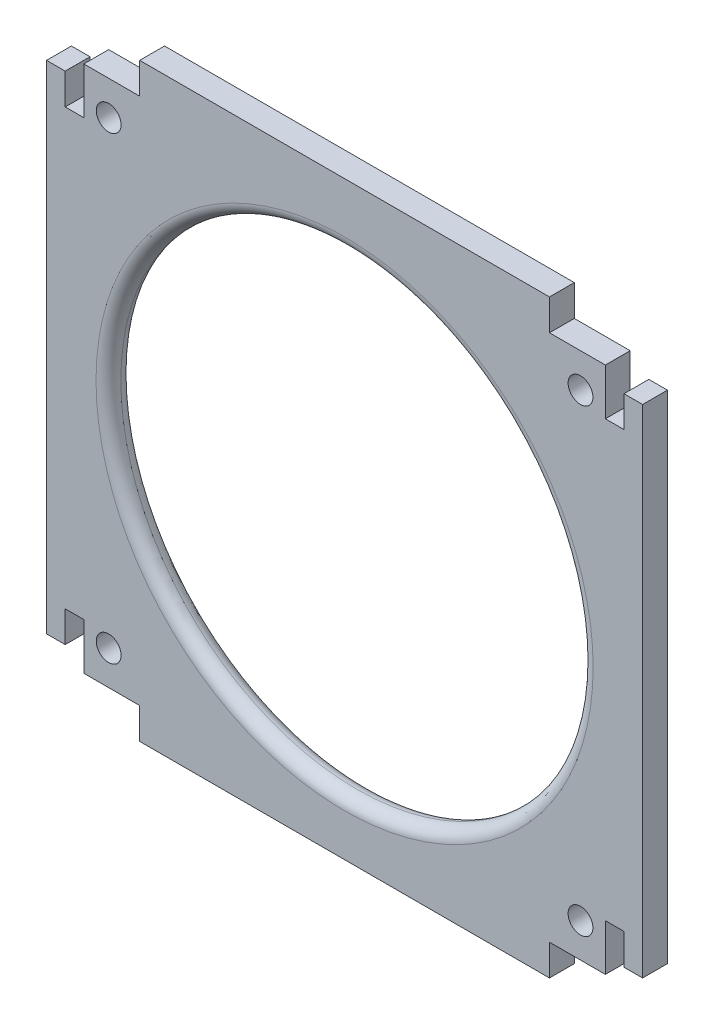
ISO-10303-21;
HEADER;
FILE_DESCRIPTION(('STEP AP214'),'2;1');
FILE_NAME('part.step','',(''),(''),'','','');
FILE_SCHEMA(('AUTOMOTIVE_DESIGN { 1 0 10303 214 1 1 1 1 }'));
ENDSEC;
DATA;
#1=APPLICATION_CONTEXT('core data for automotive mechanical design processes');
#2=APPLICATION_PROTOCOL_DEFINITION('international standard','automotive_design',2000,#1);
#3=PRODUCT_CONTEXT('',#1,'mechanical');
#4=PRODUCT('Part','Part','',(#3));
#5=PRODUCT_RELATED_PRODUCT_CATEGORY('part','',(#4));
#6=PRODUCT_DEFINITION_FORMATION('','',#4);
#7=PRODUCT_DEFINITION_CONTEXT('part definition',#1,'design');
#8=PRODUCT_DEFINITION('design','',#6,#7);
#9=PRODUCT_DEFINITION_SHAPE('','',#8);
#10=(LENGTH_UNIT() NAMED_UNIT(*) SI_UNIT(.MILLI.,.METRE.));
#11=(NAMED_UNIT(*) PLANE_ANGLE_UNIT() SI_UNIT($,.RADIAN.));
#12=(NAMED_UNIT(*) SI_UNIT($,.STERADIAN.) SOLID_ANGLE_UNIT());
#13=UNCERTAINTY_MEASURE_WITH_UNIT(LENGTH_MEASURE(1.E-05),#10,'distance_accuracy_value','');
#14=(GEOMETRIC_REPRESENTATION_CONTEXT(3) GLOBAL_UNCERTAINTY_ASSIGNED_CONTEXT((#13)) GLOBAL_UNIT_ASSIGNED_CONTEXT((#10,
#11,#12)) REPRESENTATION_CONTEXT('',''));
#15=CARTESIAN_POINT('',(0.,0.,0.));
#16=DIRECTION('',(0.,0.,1.));
#17=DIRECTION('',(1.,0.,0.));
#18=AXIS2_PLACEMENT_3D('',#15,#16,#17);
#19=CARTESIAN_POINT('',(0.,0.,4.));
#20=DIRECTION('',(0.,0.,1.));
#21=DIRECTION('',(1.,0.,0.));
#22=AXIS2_PLACEMENT_3D('',#19,#20,#21);
#23=PLANE('',#22);
#24=CARTESIAN_POINT('',(41.9999982969372,-43.1556316148785,4.));
#25=DIRECTION('',(0.,0.,1.));
#26=DIRECTION('',(1.,0.,0.));
#27=AXIS2_PLACEMENT_3D('',#24,#25,#26);
#28=CIRCLE('',#27,40.0334627101331);
#29=CARTESIAN_POINT('',(82.0334610070704,-43.1556316148785,4.));
#30=VERTEX_POINT('',#29);
#31=EDGE_CURVE('E51',#30,#30,#28,.F.);
#32=ORIENTED_EDGE('',*,*,#31,.T.);
#33=EDGE_LOOP('',(#32));
#34=FACE_BOUND('',#33,.T.);
#35=CARTESIAN_POINT('',(79.9999999999949,-79.4999734638956,4.));
#36=DIRECTION('',(0.,0.,1.));
#37=DIRECTION('',(1.,0.,0.));
#38=AXIS2_PLACEMENT_3D('',#35,#36,#37);
#39=CIRCLE('',#38,2.00000000000027);
#40=CARTESIAN_POINT('',(81.9999999999951,-79.4999734638956,4.));
#41=VERTEX_POINT('',#40);
#42=EDGE_CURVE('E411',#41,#41,#39,.T.);
#43=ORIENTED_EDGE('',*,*,#42,.F.);
#44=EDGE_LOOP('',(#43));
#45=FACE_BOUND('',#44,.T.);
#46=CARTESIAN_POINT('',(80.0000433082106,-5.49994542415699,4.));
#47=DIRECTION('',(0.,0.,1.));
#48=DIRECTION('',(1.,0.,0.));
#49=AXIS2_PLACEMENT_3D('',#46,#47,#48);
#50=CIRCLE('',#49,1.99999999999982);
#51=CARTESIAN_POINT('',(82.0000433082105,-5.49994542415699,4.));
#52=VERTEX_POINT('',#51);
#53=EDGE_CURVE('E417',#52,#52,#50,.T.);
#54=ORIENTED_EDGE('',*,*,#53,.F.);
#55=EDGE_LOOP('',(#54));
#56=FACE_BOUND('',#55,.T.);
#57=DIRECTION('',(0.,-1.,0.));
#58=VECTOR('',#57,1.);
#59=CARTESIAN_POINT('',(0.,0.,4.));
#60=LINE('',#59,#58);
#61=CARTESIAN_POINT('',(0.,0.,4.));
#62=VERTEX_POINT('',#61);
#63=CARTESIAN_POINT('',(-2.15973072759112E-13,-7.5,4.));
#64=VERTEX_POINT('',#63);
#65=EDGE_CURVE('E315',#62,#64,#60,.T.);
#66=ORIENTED_EDGE('',*,*,#65,.T.);
#67=DIRECTION('',(-1.,0.,0.));
#68=VECTOR('',#67,1.);
#69=CARTESIAN_POINT('',(-3.00000000000022,-7.5,4.));
#70=LINE('',#69,#68);
#71=CARTESIAN_POINT('',(-3.00000000000022,-7.5,4.));
#72=VERTEX_POINT('',#71);
#73=EDGE_CURVE('E163',#64,#72,#70,.T.);
#74=ORIENTED_EDGE('',*,*,#73,.T.);
#75=DIRECTION('',(0.,1.,0.));
#76=VECTOR('',#75,1.);
#77=CARTESIAN_POINT('',(-3.00000000000022,-2.5,4.));
#78=LINE('',#77,#76);
#79=CARTESIAN_POINT('',(-3.00000000000022,-2.5,4.));
#80=VERTEX_POINT('',#79);
#81=EDGE_CURVE('E429',#72,#80,#78,.T.);
#82=ORIENTED_EDGE('',*,*,#81,.T.);
#83=DIRECTION('',(-1.,0.,0.));
#84=VECTOR('',#83,1.);
#85=CARTESIAN_POINT('',(-3.00000000000022,-2.5,4.));
#86=LINE('',#85,#84);
#87=CARTESIAN_POINT('',(-6.00000000000022,-2.5,4.));
#88=VERTEX_POINT('',#87);
#89=EDGE_CURVE('E431',#80,#88,#86,.T.);
#90=ORIENTED_EDGE('',*,*,#89,.T.);
#91=DIRECTION('',(0.,-1.,0.));
#92=VECTOR('',#91,1.);
#93=CARTESIAN_POINT('',(-6.00000000000022,-2.5,4.));
#94=LINE('',#93,#92);
#95=CARTESIAN_POINT('',(-6.00000000000025,-82.4999999999997,4.));
#96=VERTEX_POINT('',#95);
#97=EDGE_CURVE('E433',#88,#96,#94,.T.);
#98=ORIENTED_EDGE('',*,*,#97,.T.);
#99=DIRECTION('',(1.,0.,0.));
#100=VECTOR('',#99,1.);
#101=CARTESIAN_POINT('',(-6.00000000000025,-82.4999999999997,4.));
#102=LINE('',#101,#100);
#103=CARTESIAN_POINT('',(-3.00000000000024,-82.4999999999997,4.));
#104=VERTEX_POINT('',#103);
#105=EDGE_CURVE('E435',#96,#104,#102,.T.);
#106=ORIENTED_EDGE('',*,*,#105,.T.);
#107=DIRECTION('',(0.,1.,0.));
#108=VECTOR('',#107,1.);
#109=CARTESIAN_POINT('',(-3.00000000000024,-82.4999999999997,4.));
#110=LINE('',#109,#108);
#111=CARTESIAN_POINT('',(-3.00000000000024,-77.4999999999997,4.));
#112=VERTEX_POINT('',#111);
#113=EDGE_CURVE('E437',#104,#112,#110,.T.);
#114=ORIENTED_EDGE('',*,*,#113,.T.);
#115=DIRECTION('',(1.,0.,0.));
#116=VECTOR('',#115,1.);
#117=CARTESIAN_POINT('',(-3.00000000000024,-77.4999999999997,4.));
#118=LINE('',#117,#116);
#119=CARTESIAN_POINT('',(-2.35922392732846E-13,-77.4999999999997,4.));
#120=VERTEX_POINT('',#119);
#121=EDGE_CURVE('E439',#112,#120,#118,.T.);
#122=ORIENTED_EDGE('',*,*,#121,.T.);
#123=DIRECTION('',(0.,-1.,0.));
#124=VECTOR('',#123,1.);
#125=CARTESIAN_POINT('',(-2.35922392732846E-13,-77.4999999999997,4.));
#126=LINE('',#125,#124);
#127=CARTESIAN_POINT('',(0.,-85.0000000000003,4.));
#128=VERTEX_POINT('',#127);
#129=EDGE_CURVE('E441',#120,#128,#126,.T.);
#130=ORIENTED_EDGE('',*,*,#129,.T.);
#131=DIRECTION('',(1.,0.,0.));
#132=VECTOR('',#131,1.);
#133=CARTESIAN_POINT('',(0.,-85.0000000000003,4.));
#134=LINE('',#133,#132);
#135=CARTESIAN_POINT('',(8.99999999999997,-85.0000000000003,4.));
#136=VERTEX_POINT('',#135);
#137=EDGE_CURVE('E443',#128,#136,#134,.T.);
#138=ORIENTED_EDGE('',*,*,#137,.T.);
#139=DIRECTION('',(0.,-1.,0.));
#140=VECTOR('',#139,1.);
#141=CARTESIAN_POINT('',(8.99999999999997,-85.0000000000003,4.));
#142=LINE('',#141,#140);
#143=CARTESIAN_POINT('',(8.99999999999997,-90.0000000000002,4.));
#144=VERTEX_POINT('',#143);
#145=EDGE_CURVE('E445',#136,#144,#142,.T.);
#146=ORIENTED_EDGE('',*,*,#145,.T.);
#147=DIRECTION('',(0.999999999999999,-3.79117202715661E-08,0.));
#148=VECTOR('',#147,1.);
#149=CARTESIAN_POINT('',(8.99999999999997,-90.0000000000002,4.));
#150=LINE('',#149,#148);
#151=CARTESIAN_POINT('',(74.9999930419732,-90.0000025021734,4.));
#152=VERTEX_POINT('',#151);
#153=EDGE_CURVE('E447',#144,#152,#150,.T.);
#154=ORIENTED_EDGE('',*,*,#153,.T.);
#155=DIRECTION('',(7.58234419695496E-08,0.999999999999997,0.));
#156=VECTOR('',#155,1.);
#157=CARTESIAN_POINT('',(74.9999930419732,-90.0000025021734,4.));
#158=LINE('',#157,#156);
#159=CARTESIAN_POINT('',(74.9999934210904,-85.0000025021736,4.));
#160=VERTEX_POINT('',#159);
#161=EDGE_CURVE('E449',#152,#160,#158,.T.);
#162=ORIENTED_EDGE('',*,*,#161,.T.);
#163=DIRECTION('',(1.,0.,0.));
#164=VECTOR('',#163,1.);
#165=CARTESIAN_POINT('',(74.9999934210904,-85.0000025021736,4.));
#166=LINE('',#165,#164);
#167=CARTESIAN_POINT('',(84.,-85.0000025021736,4.));
#168=VERTEX_POINT('',#167);
#169=EDGE_CURVE('E451',#160,#168,#166,.T.);
#170=ORIENTED_EDGE('',*,*,#169,.T.);
#171=DIRECTION('',(0.,1.,0.));
#172=VECTOR('',#171,1.);
#173=CARTESIAN_POINT('',(84.,-85.0000025021736,4.));
#174=LINE('',#173,#172);
#175=CARTESIAN_POINT('',(83.9999999999997,-77.4999999999997,4.));
#176=VERTEX_POINT('',#175);
#177=EDGE_CURVE('E453',#168,#176,#174,.T.);
#178=ORIENTED_EDGE('',*,*,#177,.T.);
#179=DIRECTION('',(1.,0.,0.));
#180=VECTOR('',#179,1.);
#181=CARTESIAN_POINT('',(83.9999999999997,-77.4999999999997,4.));
#182=LINE('',#181,#180);
#183=CARTESIAN_POINT('',(86.9999999999997,-77.4999999999997,4.));
#184=VERTEX_POINT('',#183);
#185=EDGE_CURVE('E455',#176,#184,#182,.T.);
#186=ORIENTED_EDGE('',*,*,#185,.T.);
#187=DIRECTION('',(0.,-1.,0.));
#188=VECTOR('',#187,1.);
#189=CARTESIAN_POINT('',(86.9999999999997,-77.4999999999997,4.));
#190=LINE('',#189,#188);
#191=CARTESIAN_POINT('',(86.9999999999997,-82.4999999999997,4.));
#192=VERTEX_POINT('',#191);
#193=EDGE_CURVE('E457',#184,#192,#190,.T.);
#194=ORIENTED_EDGE('',*,*,#193,.T.);
#195=DIRECTION('',(1.,0.,0.));
#196=VECTOR('',#195,1.);
#197=CARTESIAN_POINT('',(89.9999999999997,-82.4999999999997,4.));
#198=LINE('',#197,#196);
#199=CARTESIAN_POINT('',(89.9999999999997,-82.4999999999997,4.));
#200=VERTEX_POINT('',#199);
#201=EDGE_CURVE('E459',#192,#200,#198,.T.);
#202=ORIENTED_EDGE('',*,*,#201,.T.);
#203=DIRECTION('',(0.,1.,0.));
#204=VECTOR('',#203,1.);
#205=CARTESIAN_POINT('',(89.9999999999998,-2.50000000000001,4.));
#206=LINE('',#205,#204);
#207=CARTESIAN_POINT('',(89.9999999999998,-2.50000000000001,4.));
#208=VERTEX_POINT('',#207);
#209=EDGE_CURVE('E461',#200,#208,#206,.T.);
#210=ORIENTED_EDGE('',*,*,#209,.T.);
#211=DIRECTION('',(-1.,0.,0.));
#212=VECTOR('',#211,1.);
#213=CARTESIAN_POINT('',(86.9999999999998,-2.50000000000001,4.));
#214=LINE('',#213,#212);
#215=CARTESIAN_POINT('',(86.9999999999998,-2.50000000000001,4.));
#216=VERTEX_POINT('',#215);
#217=EDGE_CURVE('E463',#208,#216,#214,.T.);
#218=ORIENTED_EDGE('',*,*,#217,.T.);
#219=DIRECTION('',(0.,-1.,0.));
#220=VECTOR('',#219,1.);
#221=CARTESIAN_POINT('',(86.9999999999998,-7.50000000000001,4.));
#222=LINE('',#221,#220);
#223=CARTESIAN_POINT('',(86.9999999999998,-7.50000000000001,4.));
#224=VERTEX_POINT('',#223);
#225=EDGE_CURVE('E465',#216,#224,#222,.T.);
#226=ORIENTED_EDGE('',*,*,#225,.T.);
#227=DIRECTION('',(-1.,0.,0.));
#228=VECTOR('',#227,1.);
#229=CARTESIAN_POINT('',(83.9999999999998,-7.50000000000001,4.));
#230=LINE('',#229,#228);
#231=CARTESIAN_POINT('',(83.9999999999998,-7.50000000000001,4.));
#232=VERTEX_POINT('',#231);
#233=EDGE_CURVE('E467',#224,#232,#230,.T.);
#234=ORIENTED_EDGE('',*,*,#233,.T.);
#235=DIRECTION('',(0.,1.,0.));
#236=VECTOR('',#235,1.);
#237=CARTESIAN_POINT('',(84.,0.,4.));
#238=LINE('',#237,#236);
#239=CARTESIAN_POINT('',(84.,0.,4.));
#240=VERTEX_POINT('',#239);
#241=EDGE_CURVE('E469',#232,#240,#238,.T.);
#242=ORIENTED_EDGE('',*,*,#241,.T.);
#243=DIRECTION('',(-0.999999999999961,-2.78019294803843E-07,0.));
#244=VECTOR('',#243,1.);
#245=CARTESIAN_POINT('',(74.9999998660829,-2.50217369046624E-06,4.));
#246=LINE('',#245,#244);
#247=CARTESIAN_POINT('',(74.9999998660829,-2.50217369046624E-06,4.));
#248=VERTEX_POINT('',#247);
#249=EDGE_CURVE('E471',#240,#248,#246,.T.);
#250=ORIENTED_EDGE('',*,*,#249,.T.);
#251=DIRECTION('',(2.67834120741124E-08,1.,0.));
#252=VECTOR('',#251,1.);
#253=CARTESIAN_POINT('',(75.,4.99999999999983,4.));
#254=LINE('',#253,#252);
#255=CARTESIAN_POINT('',(75.,4.99999999999983,4.));
#256=VERTEX_POINT('',#255);
#257=EDGE_CURVE('E242',#248,#256,#254,.T.);
#258=ORIENTED_EDGE('',*,*,#257,.T.);
#259=DIRECTION('',(-1.,0.,0.));
#260=VECTOR('',#259,1.);
#261=CARTESIAN_POINT('',(8.99999999999999,4.99999999999984,4.));
#262=LINE('',#261,#260);
#263=CARTESIAN_POINT('',(8.99999999999999,4.99999999999984,4.));
#264=VERTEX_POINT('',#263);
#265=EDGE_CURVE('E236',#256,#264,#262,.T.);
#266=ORIENTED_EDGE('',*,*,#265,.T.);
#267=DIRECTION('',(0.,-1.,0.));
#268=VECTOR('',#267,1.);
#269=CARTESIAN_POINT('',(9.,-1.52655665885959E-13,4.));
#270=LINE('',#269,#268);
#271=CARTESIAN_POINT('',(9.,-1.52655665885959E-13,4.));
#272=VERTEX_POINT('',#271);
#273=EDGE_CURVE('E240',#264,#272,#270,.T.);
#274=ORIENTED_EDGE('',*,*,#273,.T.);
#275=DIRECTION('',(-1.,0.,0.));
#276=VECTOR('',#275,1.);
#277=CARTESIAN_POINT('',(0.,0.,4.));
#278=LINE('',#277,#276);
#279=EDGE_CURVE('E59',#272,#62,#278,.T.);
#280=ORIENTED_EDGE('',*,*,#279,.T.);
#281=EDGE_LOOP('',(#66,#74,#82,#90,#98,#106,#114,#122,#130,#138,#146,#154,#162,#170,#178,#186,
#194,#202,#210,#218,#226,#234,#242,#250,#258,#266,#274,#280));
#282=FACE_BOUND('',#281,.T.);
#283=CARTESIAN_POINT('',(4.00000000000489,-5.50002653610471,4.));
#284=DIRECTION('',(0.,0.,1.));
#285=DIRECTION('',(1.,0.,0.));
#286=AXIS2_PLACEMENT_3D('',#283,#284,#285);
#287=CIRCLE('',#286,1.99999999999995);
#288=CARTESIAN_POINT('',(6.00000000000484,-5.50002653610471,4.));
#289=VERTEX_POINT('',#288);
#290=EDGE_CURVE('E264',#289,#289,#287,.T.);
#291=ORIENTED_EDGE('',*,*,#290,.F.);
#292=EDGE_LOOP('',(#291));
#293=FACE_BOUND('',#292,.T.);
#294=CARTESIAN_POINT('',(3.9999566917891,-79.5000545758434,4.));
#295=DIRECTION('',(0.,0.,1.));
#296=DIRECTION('',(1.,0.,0.));
#297=AXIS2_PLACEMENT_3D('',#294,#295,#296);
#298=CIRCLE('',#297,2.00000000000002);
#299=CARTESIAN_POINT('',(5.99995669178912,-79.5000545758434,4.));
#300=VERTEX_POINT('',#299);
#301=EDGE_CURVE('E403',#300,#300,#298,.T.);
#302=ORIENTED_EDGE('',*,*,#301,.F.);
#303=EDGE_LOOP('',(#302));
#304=FACE_BOUND('',#303,.T.);
#305=ADVANCED_FACE('F41',(#34,#45,#56,#282,#293,#304),#23,.T.);
#306=CARTESIAN_POINT('',(0.,0.,0.));
#307=DIRECTION('',(0.,0.,1.));
#308=DIRECTION('',(1.,0.,0.));
#309=AXIS2_PLACEMENT_3D('',#306,#307,#308);
#310=PLANE('',#309);
#311=CARTESIAN_POINT('',(41.9999982969372,-43.1556316148785,0.));
#312=DIRECTION('',(0.,0.,1.));
#313=DIRECTION('',(1.,0.,0.));
#314=AXIS2_PLACEMENT_3D('',#311,#312,#313);
#315=CIRCLE('',#314,40.0334627101331);
#316=CARTESIAN_POINT('',(82.0334610070704,-43.1556316148785,0.));
#317=VERTEX_POINT('',#316);
#318=EDGE_CURVE('E11',#317,#317,#315,.T.);
#319=ORIENTED_EDGE('',*,*,#318,.T.);
#320=EDGE_LOOP('',(#319));
#321=FACE_BOUND('',#320,.T.);
#322=DIRECTION('',(0.,-1.,0.));
#323=VECTOR('',#322,1.);
#324=CARTESIAN_POINT('',(0.,0.,0.));
#325=LINE('',#324,#323);
#326=CARTESIAN_POINT('',(0.,0.,0.));
#327=VERTEX_POINT('',#326);
#328=CARTESIAN_POINT('',(-2.15973072759112E-13,-7.5,0.));
#329=VERTEX_POINT('',#328);
#330=EDGE_CURVE('E260',#327,#329,#325,.T.);
#331=ORIENTED_EDGE('',*,*,#330,.F.);
#332=DIRECTION('',(-1.,0.,0.));
#333=VECTOR('',#332,1.);
#334=CARTESIAN_POINT('',(0.,0.,0.));
#335=LINE('',#334,#333);
#336=CARTESIAN_POINT('',(9.,-1.52655665885959E-13,0.));
#337=VERTEX_POINT('',#336);
#338=EDGE_CURVE('E154',#337,#327,#335,.T.);
#339=ORIENTED_EDGE('',*,*,#338,.F.);
#340=DIRECTION('',(0.,-1.,0.));
#341=VECTOR('',#340,1.);
#342=CARTESIAN_POINT('',(9.,-1.52655665885959E-13,0.));
#343=LINE('',#342,#341);
#344=CARTESIAN_POINT('',(8.99999999999999,4.99999999999984,0.));
#345=VERTEX_POINT('',#344);
#346=EDGE_CURVE('E148',#345,#337,#343,.T.);
#347=ORIENTED_EDGE('',*,*,#346,.F.);
#348=DIRECTION('',(-1.,0.,0.));
#349=VECTOR('',#348,1.);
#350=CARTESIAN_POINT('',(8.99999999999999,4.99999999999984,0.));
#351=LINE('',#350,#349);
#352=CARTESIAN_POINT('',(75.,4.99999999999983,0.));
#353=VERTEX_POINT('',#352);
#354=EDGE_CURVE('E250',#353,#345,#351,.T.);
#355=ORIENTED_EDGE('',*,*,#354,.F.);
#356=DIRECTION('',(2.67834120741124E-08,1.,0.));
#357=VECTOR('',#356,1.);
#358=CARTESIAN_POINT('',(75.,4.99999999999983,0.));
#359=LINE('',#358,#357);
#360=CARTESIAN_POINT('',(74.9999998660829,-2.50217369046624E-06,0.));
#361=VERTEX_POINT('',#360);
#362=EDGE_CURVE('E310',#361,#353,#359,.T.);
#363=ORIENTED_EDGE('',*,*,#362,.F.);
#364=DIRECTION('',(-0.999999999999961,-2.78019294803843E-07,0.));
#365=VECTOR('',#364,1.);
#366=CARTESIAN_POINT('',(74.9999998660829,-2.50217369046624E-06,0.));
#367=LINE('',#366,#365);
#368=CARTESIAN_POINT('',(84.,0.,0.));
#369=VERTEX_POINT('',#368);
#370=EDGE_CURVE('E308',#369,#361,#367,.T.);
#371=ORIENTED_EDGE('',*,*,#370,.F.);
#372=DIRECTION('',(0.,1.,0.));
#373=VECTOR('',#372,1.);
#374=CARTESIAN_POINT('',(84.,0.,0.));
#375=LINE('',#374,#373);
#376=CARTESIAN_POINT('',(83.9999999999998,-7.50000000000001,0.));
#377=VERTEX_POINT('',#376);
#378=EDGE_CURVE('E306',#377,#369,#375,.T.);
#379=ORIENTED_EDGE('',*,*,#378,.F.);
#380=DIRECTION('',(-1.,0.,0.));
#381=VECTOR('',#380,1.);
#382=CARTESIAN_POINT('',(83.9999999999998,-7.50000000000001,0.));
#383=LINE('',#382,#381);
#384=CARTESIAN_POINT('',(86.9999999999998,-7.50000000000001,0.));
#385=VERTEX_POINT('',#384);
#386=EDGE_CURVE('E304',#385,#377,#383,.T.);
#387=ORIENTED_EDGE('',*,*,#386,.F.);
#388=DIRECTION('',(0.,-1.,0.));
#389=VECTOR('',#388,1.);
#390=CARTESIAN_POINT('',(86.9999999999998,-7.50000000000001,0.));
#391=LINE('',#390,#389);
#392=CARTESIAN_POINT('',(86.9999999999998,-2.50000000000001,0.));
#393=VERTEX_POINT('',#392);
#394=EDGE_CURVE('E302',#393,#385,#391,.T.);
#395=ORIENTED_EDGE('',*,*,#394,.F.);
#396=DIRECTION('',(-1.,0.,0.));
#397=VECTOR('',#396,1.);
#398=CARTESIAN_POINT('',(86.9999999999998,-2.50000000000001,0.));
#399=LINE('',#398,#397);
#400=CARTESIAN_POINT('',(89.9999999999998,-2.50000000000001,0.));
#401=VERTEX_POINT('',#400);
#402=EDGE_CURVE('E300',#401,#393,#399,.T.);
#403=ORIENTED_EDGE('',*,*,#402,.F.);
#404=DIRECTION('',(0.,1.,0.));
#405=VECTOR('',#404,1.);
#406=CARTESIAN_POINT('',(89.9999999999998,-2.50000000000001,0.));
#407=LINE('',#406,#405);
#408=CARTESIAN_POINT('',(89.9999999999997,-82.4999999999997,0.));
#409=VERTEX_POINT('',#408);
#410=EDGE_CURVE('E298',#409,#401,#407,.T.);
#411=ORIENTED_EDGE('',*,*,#410,.F.);
#412=DIRECTION('',(1.,0.,0.));
#413=VECTOR('',#412,1.);
#414=CARTESIAN_POINT('',(89.9999999999997,-82.4999999999997,0.));
#415=LINE('',#414,#413);
#416=CARTESIAN_POINT('',(86.9999999999997,-82.4999999999997,0.));
#417=VERTEX_POINT('',#416);
#418=EDGE_CURVE('E296',#417,#409,#415,.T.);
#419=ORIENTED_EDGE('',*,*,#418,.F.);
#420=DIRECTION('',(0.,-1.,0.));
#421=VECTOR('',#420,1.);
#422=CARTESIAN_POINT('',(86.9999999999997,-77.4999999999997,0.));
#423=LINE('',#422,#421);
#424=CARTESIAN_POINT('',(86.9999999999997,-77.4999999999997,0.));
#425=VERTEX_POINT('',#424);
#426=EDGE_CURVE('E294',#425,#417,#423,.T.);
#427=ORIENTED_EDGE('',*,*,#426,.F.);
#428=DIRECTION('',(1.,0.,0.));
#429=VECTOR('',#428,1.);
#430=CARTESIAN_POINT('',(83.9999999999997,-77.4999999999997,0.));
#431=LINE('',#430,#429);
#432=CARTESIAN_POINT('',(83.9999999999997,-77.4999999999997,0.));
#433=VERTEX_POINT('',#432);
#434=EDGE_CURVE('E292',#433,#425,#431,.T.);
#435=ORIENTED_EDGE('',*,*,#434,.F.);
#436=DIRECTION('',(0.,1.,0.));
#437=VECTOR('',#436,1.);
#438=CARTESIAN_POINT('',(84.,-85.0000025021736,0.));
#439=LINE('',#438,#437);
#440=CARTESIAN_POINT('',(84.,-85.0000025021736,0.));
#441=VERTEX_POINT('',#440);
#442=EDGE_CURVE('E290',#441,#433,#439,.T.);
#443=ORIENTED_EDGE('',*,*,#442,.F.);
#444=DIRECTION('',(1.,0.,0.));
#445=VECTOR('',#444,1.);
#446=CARTESIAN_POINT('',(74.9999934210904,-85.0000025021736,0.));
#447=LINE('',#446,#445);
#448=CARTESIAN_POINT('',(74.9999934210904,-85.0000025021736,0.));
#449=VERTEX_POINT('',#448);
#450=EDGE_CURVE('E288',#449,#441,#447,.T.);
#451=ORIENTED_EDGE('',*,*,#450,.F.);
#452=DIRECTION('',(7.58234419695496E-08,0.999999999999997,0.));
#453=VECTOR('',#452,1.);
#454=CARTESIAN_POINT('',(74.9999930419732,-90.0000025021734,0.));
#455=LINE('',#454,#453);
#456=CARTESIAN_POINT('',(74.9999930419732,-90.0000025021734,0.));
#457=VERTEX_POINT('',#456);
#458=EDGE_CURVE('E286',#457,#449,#455,.T.);
#459=ORIENTED_EDGE('',*,*,#458,.F.);
#460=DIRECTION('',(0.999999999999999,-3.79117202715661E-08,0.));
#461=VECTOR('',#460,1.);
#462=CARTESIAN_POINT('',(8.99999999999997,-90.0000000000002,0.));
#463=LINE('',#462,#461);
#464=CARTESIAN_POINT('',(8.99999999999997,-90.0000000000002,0.));
#465=VERTEX_POINT('',#464);
#466=EDGE_CURVE('E284',#465,#457,#463,.T.);
#467=ORIENTED_EDGE('',*,*,#466,.F.);
#468=DIRECTION('',(0.,-1.,0.));
#469=VECTOR('',#468,1.);
#470=CARTESIAN_POINT('',(8.99999999999997,-85.0000000000003,0.));
#471=LINE('',#470,#469);
#472=CARTESIAN_POINT('',(8.99999999999997,-85.0000000000003,0.));
#473=VERTEX_POINT('',#472);
#474=EDGE_CURVE('E282',#473,#465,#471,.T.);
#475=ORIENTED_EDGE('',*,*,#474,.F.);
#476=DIRECTION('',(1.,0.,0.));
#477=VECTOR('',#476,1.);
#478=CARTESIAN_POINT('',(0.,-85.0000000000003,0.));
#479=LINE('',#478,#477);
#480=CARTESIAN_POINT('',(0.,-85.0000000000003,0.));
#481=VERTEX_POINT('',#480);
#482=EDGE_CURVE('E280',#481,#473,#479,.T.);
#483=ORIENTED_EDGE('',*,*,#482,.F.);
#484=DIRECTION('',(0.,-1.,0.));
#485=VECTOR('',#484,1.);
#486=CARTESIAN_POINT('',(-2.35922392732846E-13,-77.4999999999997,0.));
#487=LINE('',#486,#485);
#488=CARTESIAN_POINT('',(-2.35922392732846E-13,-77.4999999999997,0.));
#489=VERTEX_POINT('',#488);
#490=EDGE_CURVE('E278',#489,#481,#487,.T.);
#491=ORIENTED_EDGE('',*,*,#490,.F.);
#492=DIRECTION('',(1.,0.,0.));
#493=VECTOR('',#492,1.);
#494=CARTESIAN_POINT('',(-3.00000000000024,-77.4999999999997,0.));
#495=LINE('',#494,#493);
#496=CARTESIAN_POINT('',(-3.00000000000024,-77.4999999999997,0.));
#497=VERTEX_POINT('',#496);
#498=EDGE_CURVE('E276',#497,#489,#495,.T.);
#499=ORIENTED_EDGE('',*,*,#498,.F.);
#500=DIRECTION('',(0.,1.,0.));
#501=VECTOR('',#500,1.);
#502=CARTESIAN_POINT('',(-3.00000000000024,-82.4999999999997,0.));
#503=LINE('',#502,#501);
#504=CARTESIAN_POINT('',(-3.00000000000024,-82.4999999999997,0.));
#505=VERTEX_POINT('',#504);
#506=EDGE_CURVE('E274',#505,#497,#503,.T.);
#507=ORIENTED_EDGE('',*,*,#506,.F.);
#508=DIRECTION('',(1.,0.,0.));
#509=VECTOR('',#508,1.);
#510=CARTESIAN_POINT('',(-6.00000000000025,-82.4999999999997,0.));
#511=LINE('',#510,#509);
#512=CARTESIAN_POINT('',(-6.00000000000025,-82.4999999999997,0.));
#513=VERTEX_POINT('',#512);
#514=EDGE_CURVE('E272',#513,#505,#511,.T.);
#515=ORIENTED_EDGE('',*,*,#514,.F.);
#516=DIRECTION('',(0.,-1.,0.));
#517=VECTOR('',#516,1.);
#518=CARTESIAN_POINT('',(-6.00000000000022,-2.5,0.));
#519=LINE('',#518,#517);
#520=CARTESIAN_POINT('',(-6.00000000000022,-2.5,0.));
#521=VERTEX_POINT('',#520);
#522=EDGE_CURVE('E270',#521,#513,#519,.T.);
#523=ORIENTED_EDGE('',*,*,#522,.F.);
#524=DIRECTION('',(-1.,0.,0.));
#525=VECTOR('',#524,1.);
#526=CARTESIAN_POINT('',(-3.00000000000022,-2.5,0.));
#527=LINE('',#526,#525);
#528=CARTESIAN_POINT('',(-3.00000000000022,-2.5,0.));
#529=VERTEX_POINT('',#528);
#530=EDGE_CURVE('E268',#529,#521,#527,.T.);
#531=ORIENTED_EDGE('',*,*,#530,.F.);
#532=DIRECTION('',(0.,1.,0.));
#533=VECTOR('',#532,1.);
#534=CARTESIAN_POINT('',(-3.00000000000022,-2.5,0.));
#535=LINE('',#534,#533);
#536=CARTESIAN_POINT('',(-3.00000000000022,-7.5,0.));
#537=VERTEX_POINT('',#536);
#538=EDGE_CURVE('E266',#537,#529,#535,.T.);
#539=ORIENTED_EDGE('',*,*,#538,.F.);
#540=DIRECTION('',(-1.,0.,0.));
#541=VECTOR('',#540,1.);
#542=CARTESIAN_POINT('',(-3.00000000000022,-7.5,0.));
#543=LINE('',#542,#541);
#544=EDGE_CURVE('E263',#329,#537,#543,.T.);
#545=ORIENTED_EDGE('',*,*,#544,.F.);
#546=EDGE_LOOP('',(#331,#339,#347,#355,#363,#371,#379,#387,#395,#403,#411,#419,#427,#435,#443,
#451,#459,#467,#475,#483,#491,#499,#507,#515,#523,#531,#539,#545));
#547=FACE_BOUND('',#546,.T.);
#548=CARTESIAN_POINT('',(4.00000000000489,-5.50002653610471,0.));
#549=DIRECTION('',(0.,0.,1.));
#550=DIRECTION('',(1.,0.,0.));
#551=AXIS2_PLACEMENT_3D('',#548,#549,#550);
#552=CIRCLE('',#551,1.99999999999995);
#553=CARTESIAN_POINT('',(6.00000000000484,-5.50002653610471,0.));
#554=VERTEX_POINT('',#553);
#555=EDGE_CURVE('E420',#554,#554,#552,.T.);
#556=ORIENTED_EDGE('',*,*,#555,.T.);
#557=EDGE_LOOP('',(#556));
#558=FACE_BOUND('',#557,.T.);
#559=CARTESIAN_POINT('',(80.0000433082106,-5.49994542415699,0.));
#560=DIRECTION('',(0.,0.,1.));
#561=DIRECTION('',(1.,0.,0.));
#562=AXIS2_PLACEMENT_3D('',#559,#560,#561);
#563=CIRCLE('',#562,1.99999999999982);
#564=CARTESIAN_POINT('',(82.0000433082105,-5.49994542415699,0.));
#565=VERTEX_POINT('',#564);
#566=EDGE_CURVE('E414',#565,#565,#563,.T.);
#567=ORIENTED_EDGE('',*,*,#566,.T.);
#568=EDGE_LOOP('',(#567));
#569=FACE_BOUND('',#568,.T.);
#570=CARTESIAN_POINT('',(79.9999999999949,-79.4999734638956,0.));
#571=DIRECTION('',(0.,0.,1.));
#572=DIRECTION('',(1.,0.,0.));
#573=AXIS2_PLACEMENT_3D('',#570,#571,#572);
#574=CIRCLE('',#573,2.00000000000027);
#575=CARTESIAN_POINT('',(81.9999999999951,-79.4999734638956,0.));
#576=VERTEX_POINT('',#575);
#577=EDGE_CURVE('E408',#576,#576,#574,.T.);
#578=ORIENTED_EDGE('',*,*,#577,.T.);
#579=EDGE_LOOP('',(#578));
#580=FACE_BOUND('',#579,.T.);
#581=CARTESIAN_POINT('',(3.9999566917891,-79.5000545758434,0.));
#582=DIRECTION('',(0.,0.,1.));
#583=DIRECTION('',(1.,0.,0.));
#584=AXIS2_PLACEMENT_3D('',#581,#582,#583);
#585=CIRCLE('',#584,2.00000000000002);
#586=CARTESIAN_POINT('',(5.99995669178912,-79.5000545758434,0.));
#587=VERTEX_POINT('',#586);
#588=EDGE_CURVE('E401',#587,#587,#585,.T.);
#589=ORIENTED_EDGE('',*,*,#588,.T.);
#590=EDGE_LOOP('',(#589));
#591=FACE_BOUND('',#590,.T.);
#592=ADVANCED_FACE('F484',(#321,#547,#558,#569,#580,#591),#310,.F.);
#593=CARTESIAN_POINT('',(0.,0.,4.));
#594=DIRECTION('',(1.,0.,0.));
#595=DIRECTION('',(0.,1.,0.));
#596=AXIS2_PLACEMENT_3D('',#593,#594,#595);
#597=PLANE('',#596);
#598=ORIENTED_EDGE('',*,*,#330,.T.);
#599=DIRECTION('',(0.,0.,-1.));
#600=VECTOR('',#599,1.);
#601=CARTESIAN_POINT('',(-2.15973072759112E-13,-7.5,4.));
#602=LINE('',#601,#600);
#603=EDGE_CURVE('E388',#64,#329,#602,.T.);
#604=ORIENTED_EDGE('',*,*,#603,.F.);
#605=ORIENTED_EDGE('',*,*,#65,.F.);
#606=DIRECTION('',(0.,0.,-1.));
#607=VECTOR('',#606,1.);
#608=CARTESIAN_POINT('',(0.,0.,4.));
#609=LINE('',#608,#607);
#610=EDGE_CURVE('E256',#62,#327,#609,.T.);
#611=ORIENTED_EDGE('',*,*,#610,.T.);
#612=EDGE_LOOP('',(#598,#604,#605,#611));
#613=FACE_BOUND('',#612,.T.);
#614=ADVANCED_FACE('F489',(#613),#597,.F.);
#615=CARTESIAN_POINT('',(-3.00000000000022,-7.5,4.));
#616=DIRECTION('',(0.,-1.,0.));
#617=DIRECTION('',(0.,0.,-1.));
#618=AXIS2_PLACEMENT_3D('',#615,#616,#617);
#619=PLANE('',#618);
#620=ORIENTED_EDGE('',*,*,#544,.T.);
#621=DIRECTION('',(0.,0.,-1.));
#622=VECTOR('',#621,1.);
#623=CARTESIAN_POINT('',(-3.00000000000022,-7.5,4.));
#624=LINE('',#623,#622);
#625=EDGE_CURVE('E385',#72,#537,#624,.T.);
#626=ORIENTED_EDGE('',*,*,#625,.F.);
#627=ORIENTED_EDGE('',*,*,#73,.F.);
#628=ORIENTED_EDGE('',*,*,#603,.T.);
#629=EDGE_LOOP('',(#620,#626,#627,#628));
#630=FACE_BOUND('',#629,.T.);
#631=ADVANCED_FACE('F778',(#630),#619,.F.);
#632=CARTESIAN_POINT('',(-3.00000000000022,-2.5,4.));
#633=DIRECTION('',(-1.,0.,0.));
#634=DIRECTION('',(0.,0.,1.));
#635=AXIS2_PLACEMENT_3D('',#632,#633,#634);
#636=PLANE('',#635);
#637=ORIENTED_EDGE('',*,*,#538,.T.);
#638=DIRECTION('',(0.,0.,-1.));
#639=VECTOR('',#638,1.);
#640=CARTESIAN_POINT('',(-3.00000000000022,-2.5,4.));
#641=LINE('',#640,#639);
#642=EDGE_CURVE('E382',#80,#529,#641,.T.);
#643=ORIENTED_EDGE('',*,*,#642,.F.);
#644=ORIENTED_EDGE('',*,*,#81,.F.);
#645=ORIENTED_EDGE('',*,*,#625,.T.);
#646=EDGE_LOOP('',(#637,#643,#644,#645));
#647=FACE_BOUND('',#646,.T.);
#648=ADVANCED_FACE('F769',(#647),#636,.F.);
#649=CARTESIAN_POINT('',(-3.00000000000022,-2.5,4.));
#650=DIRECTION('',(0.,-1.,0.));
#651=DIRECTION('',(0.,0.,-1.));
#652=AXIS2_PLACEMENT_3D('',#649,#650,#651);
#653=PLANE('',#652);
#654=ORIENTED_EDGE('',*,*,#530,.T.);
#655=DIRECTION('',(0.,0.,-1.));
#656=VECTOR('',#655,1.);
#657=CARTESIAN_POINT('',(-6.00000000000022,-2.5,4.));
#658=LINE('',#657,#656);
#659=EDGE_CURVE('E379',#88,#521,#658,.T.);
#660=ORIENTED_EDGE('',*,*,#659,.F.);
#661=ORIENTED_EDGE('',*,*,#89,.F.);
#662=ORIENTED_EDGE('',*,*,#642,.T.);
#663=EDGE_LOOP('',(#654,#660,#661,#662));
#664=FACE_BOUND('',#663,.T.);
#665=ADVANCED_FACE('F760',(#664),#653,.F.);
#666=CARTESIAN_POINT('',(-6.00000000000022,-2.5,4.));
#667=DIRECTION('',(1.,0.,0.));
#668=DIRECTION('',(0.,1.,0.));
#669=AXIS2_PLACEMENT_3D('',#666,#667,#668);
#670=PLANE('',#669);
#671=ORIENTED_EDGE('',*,*,#522,.T.);
#672=DIRECTION('',(0.,0.,-1.));
#673=VECTOR('',#672,1.);
#674=CARTESIAN_POINT('',(-6.00000000000025,-82.4999999999997,4.));
#675=LINE('',#674,#673);
#676=EDGE_CURVE('E376',#96,#513,#675,.T.);
#677=ORIENTED_EDGE('',*,*,#676,.F.);
#678=ORIENTED_EDGE('',*,*,#97,.F.);
#679=ORIENTED_EDGE('',*,*,#659,.T.);
#680=EDGE_LOOP('',(#671,#677,#678,#679));
#681=FACE_BOUND('',#680,.T.);
#682=ADVANCED_FACE('F751',(#681),#670,.F.);
#683=CARTESIAN_POINT('',(-6.00000000000025,-82.4999999999997,4.));
#684=DIRECTION('',(0.,1.,0.));
#685=DIRECTION('',(0.,0.,1.));
#686=AXIS2_PLACEMENT_3D('',#683,#684,#685);
#687=PLANE('',#686);
#688=ORIENTED_EDGE('',*,*,#514,.T.);
#689=DIRECTION('',(0.,0.,-1.));
#690=VECTOR('',#689,1.);
#691=CARTESIAN_POINT('',(-3.00000000000024,-82.4999999999997,4.));
#692=LINE('',#691,#690);
#693=EDGE_CURVE('E373',#104,#505,#692,.T.);
#694=ORIENTED_EDGE('',*,*,#693,.F.);
#695=ORIENTED_EDGE('',*,*,#105,.F.);
#696=ORIENTED_EDGE('',*,*,#676,.T.);
#697=EDGE_LOOP('',(#688,#694,#695,#696));
#698=FACE_BOUND('',#697,.T.);
#699=ADVANCED_FACE('F742',(#698),#687,.F.);
#700=CARTESIAN_POINT('',(-3.00000000000024,-82.4999999999997,4.));
#701=DIRECTION('',(-1.,0.,0.));
#702=DIRECTION('',(0.,0.,1.));
#703=AXIS2_PLACEMENT_3D('',#700,#701,#702);
#704=PLANE('',#703);
#705=ORIENTED_EDGE('',*,*,#506,.T.);
#706=DIRECTION('',(0.,0.,-1.));
#707=VECTOR('',#706,1.);
#708=CARTESIAN_POINT('',(-3.00000000000024,-77.4999999999997,4.));
#709=LINE('',#708,#707);
#710=EDGE_CURVE('E370',#112,#497,#709,.T.);
#711=ORIENTED_EDGE('',*,*,#710,.F.);
#712=ORIENTED_EDGE('',*,*,#113,.F.);
#713=ORIENTED_EDGE('',*,*,#693,.T.);
#714=EDGE_LOOP('',(#705,#711,#712,#713));
#715=FACE_BOUND('',#714,.T.);
#716=ADVANCED_FACE('F733',(#715),#704,.F.);
#717=CARTESIAN_POINT('',(-3.00000000000024,-77.4999999999997,4.));
#718=DIRECTION('',(0.,1.,0.));
#719=DIRECTION('',(0.,0.,1.));
#720=AXIS2_PLACEMENT_3D('',#717,#718,#719);
#721=PLANE('',#720);
#722=ORIENTED_EDGE('',*,*,#498,.T.);
#723=DIRECTION('',(0.,0.,-1.));
#724=VECTOR('',#723,1.);
#725=CARTESIAN_POINT('',(-2.35922392732846E-13,-77.4999999999997,4.));
#726=LINE('',#725,#724);
#727=EDGE_CURVE('E367',#120,#489,#726,.T.);
#728=ORIENTED_EDGE('',*,*,#727,.F.);
#729=ORIENTED_EDGE('',*,*,#121,.F.);
#730=ORIENTED_EDGE('',*,*,#710,.T.);
#731=EDGE_LOOP('',(#722,#728,#729,#730));
#732=FACE_BOUND('',#731,.T.);
#733=ADVANCED_FACE('F724',(#732),#721,.F.);
#734=CARTESIAN_POINT('',(-2.35922392732846E-13,-77.4999999999997,4.));
#735=DIRECTION('',(1.,0.,0.));
#736=DIRECTION('',(0.,1.,0.));
#737=AXIS2_PLACEMENT_3D('',#734,#735,#736);
#738=PLANE('',#737);
#739=ORIENTED_EDGE('',*,*,#490,.T.);
#740=DIRECTION('',(0.,0.,-1.));
#741=VECTOR('',#740,1.);
#742=CARTESIAN_POINT('',(0.,-85.0000000000003,4.));
#743=LINE('',#742,#741);
#744=EDGE_CURVE('E364',#128,#481,#743,.T.);
#745=ORIENTED_EDGE('',*,*,#744,.F.);
#746=ORIENTED_EDGE('',*,*,#129,.F.);
#747=ORIENTED_EDGE('',*,*,#727,.T.);
#748=EDGE_LOOP('',(#739,#745,#746,#747));
#749=FACE_BOUND('',#748,.T.);
#750=ADVANCED_FACE('F715',(#749),#738,.F.);
#751=CARTESIAN_POINT('',(0.,-85.0000000000003,4.));
#752=DIRECTION('',(0.,1.,0.));
#753=DIRECTION('',(0.,0.,1.));
#754=AXIS2_PLACEMENT_3D('',#751,#752,#753);
#755=PLANE('',#754);
#756=ORIENTED_EDGE('',*,*,#482,.T.);
#757=DIRECTION('',(0.,0.,-1.));
#758=VECTOR('',#757,1.);
#759=CARTESIAN_POINT('',(8.99999999999997,-85.0000000000003,4.));
#760=LINE('',#759,#758);
#761=EDGE_CURVE('E361',#136,#473,#760,.T.);
#762=ORIENTED_EDGE('',*,*,#761,.F.);
#763=ORIENTED_EDGE('',*,*,#137,.F.);
#764=ORIENTED_EDGE('',*,*,#744,.T.);
#765=EDGE_LOOP('',(#756,#762,#763,#764));
#766=FACE_BOUND('',#765,.T.);
#767=ADVANCED_FACE('F706',(#766),#755,.F.);
#768=CARTESIAN_POINT('',(8.99999999999997,-85.0000000000003,4.));
#769=DIRECTION('',(1.,0.,0.));
#770=DIRECTION('',(0.,0.,-1.));
#771=AXIS2_PLACEMENT_3D('',#768,#769,#770);
#772=PLANE('',#771);
#773=ORIENTED_EDGE('',*,*,#474,.T.);
#774=DIRECTION('',(0.,0.,-1.));
#775=VECTOR('',#774,1.);
#776=CARTESIAN_POINT('',(8.99999999999997,-90.0000000000002,4.));
#777=LINE('',#776,#775);
#778=EDGE_CURVE('E358',#144,#465,#777,.T.);
#779=ORIENTED_EDGE('',*,*,#778,.F.);
#780=ORIENTED_EDGE('',*,*,#145,.F.);
#781=ORIENTED_EDGE('',*,*,#761,.T.);
#782=EDGE_LOOP('',(#773,#779,#780,#781));
#783=FACE_BOUND('',#782,.T.);
#784=ADVANCED_FACE('F697',(#783),#772,.F.);
#785=CARTESIAN_POINT('',(8.99999999999997,-90.0000000000002,4.));
#786=DIRECTION('',(3.79117202715661E-08,0.999999999999999,0.));
#787=DIRECTION('',(-0.999999999999999,3.79117202715661E-08,0.));
#788=AXIS2_PLACEMENT_3D('',#785,#786,#787);
#789=PLANE('',#788);
#790=ORIENTED_EDGE('',*,*,#466,.T.);
#791=DIRECTION('',(0.,0.,-1.));
#792=VECTOR('',#791,1.);
#793=CARTESIAN_POINT('',(74.9999930419732,-90.0000025021734,4.));
#794=LINE('',#793,#792);
#795=EDGE_CURVE('E355',#152,#457,#794,.T.);
#796=ORIENTED_EDGE('',*,*,#795,.F.);
#797=ORIENTED_EDGE('',*,*,#153,.F.);
#798=ORIENTED_EDGE('',*,*,#778,.T.);
#799=EDGE_LOOP('',(#790,#796,#797,#798));
#800=FACE_BOUND('',#799,.T.);
#801=ADVANCED_FACE('F688',(#800),#789,.F.);
#802=CARTESIAN_POINT('',(74.9999930419732,-90.0000025021734,4.));
#803=DIRECTION('',(-0.999999999999997,7.58234419695496E-08,0.));
#804=DIRECTION('',(-7.58234419695496E-08,-0.999999999999997,0.));
#805=AXIS2_PLACEMENT_3D('',#802,#803,#804);
#806=PLANE('',#805);
#807=ORIENTED_EDGE('',*,*,#458,.T.);
#808=DIRECTION('',(0.,0.,-1.));
#809=VECTOR('',#808,1.);
#810=CARTESIAN_POINT('',(74.9999934210904,-85.0000025021736,4.));
#811=LINE('',#810,#809);
#812=EDGE_CURVE('E352',#160,#449,#811,.T.);
#813=ORIENTED_EDGE('',*,*,#812,.F.);
#814=ORIENTED_EDGE('',*,*,#161,.F.);
#815=ORIENTED_EDGE('',*,*,#795,.T.);
#816=EDGE_LOOP('',(#807,#813,#814,#815));
#817=FACE_BOUND('',#816,.T.);
#818=ADVANCED_FACE('F679',(#817),#806,.F.);
#819=CARTESIAN_POINT('',(74.9999934210904,-85.0000025021736,4.));
#820=DIRECTION('',(0.,1.,0.));
#821=DIRECTION('',(0.,0.,1.));
#822=AXIS2_PLACEMENT_3D('',#819,#820,#821);
#823=PLANE('',#822);
#824=ORIENTED_EDGE('',*,*,#450,.T.);
#825=DIRECTION('',(0.,0.,-1.));
#826=VECTOR('',#825,1.);
#827=CARTESIAN_POINT('',(84.,-85.0000025021736,4.));
#828=LINE('',#827,#826);
#829=EDGE_CURVE('E349',#168,#441,#828,.T.);
#830=ORIENTED_EDGE('',*,*,#829,.F.);
#831=ORIENTED_EDGE('',*,*,#169,.F.);
#832=ORIENTED_EDGE('',*,*,#812,.T.);
#833=EDGE_LOOP('',(#824,#830,#831,#832));
#834=FACE_BOUND('',#833,.T.);
#835=ADVANCED_FACE('F670',(#834),#823,.F.);
#836=CARTESIAN_POINT('',(84.,-85.0000025021736,4.));
#837=DIRECTION('',(-1.,0.,0.));
#838=DIRECTION('',(0.,-1.,0.));
#839=AXIS2_PLACEMENT_3D('',#836,#837,#838);
#840=PLANE('',#839);
#841=ORIENTED_EDGE('',*,*,#442,.T.);
#842=DIRECTION('',(0.,0.,-1.));
#843=VECTOR('',#842,1.);
#844=CARTESIAN_POINT('',(83.9999999999997,-77.4999999999997,4.));
#845=LINE('',#844,#843);
#846=EDGE_CURVE('E346',#176,#433,#845,.T.);
#847=ORIENTED_EDGE('',*,*,#846,.F.);
#848=ORIENTED_EDGE('',*,*,#177,.F.);
#849=ORIENTED_EDGE('',*,*,#829,.T.);
#850=EDGE_LOOP('',(#841,#847,#848,#849));
#851=FACE_BOUND('',#850,.T.);
#852=ADVANCED_FACE('F661',(#851),#840,.F.);
#853=CARTESIAN_POINT('',(83.9999999999997,-77.4999999999997,4.));
#854=DIRECTION('',(0.,1.,0.));
#855=DIRECTION('',(0.,0.,1.));
#856=AXIS2_PLACEMENT_3D('',#853,#854,#855);
#857=PLANE('',#856);
#858=ORIENTED_EDGE('',*,*,#434,.T.);
#859=DIRECTION('',(0.,0.,-1.));
#860=VECTOR('',#859,1.);
#861=CARTESIAN_POINT('',(86.9999999999997,-77.4999999999997,4.));
#862=LINE('',#861,#860);
#863=EDGE_CURVE('E343',#184,#425,#862,.T.);
#864=ORIENTED_EDGE('',*,*,#863,.F.);
#865=ORIENTED_EDGE('',*,*,#185,.F.);
#866=ORIENTED_EDGE('',*,*,#846,.T.);
#867=EDGE_LOOP('',(#858,#864,#865,#866));
#868=FACE_BOUND('',#867,.T.);
#869=ADVANCED_FACE('F652',(#868),#857,.F.);
#870=CARTESIAN_POINT('',(86.9999999999997,-77.4999999999997,4.));
#871=DIRECTION('',(1.,0.,0.));
#872=DIRECTION('',(0.,0.,-1.));
#873=AXIS2_PLACEMENT_3D('',#870,#871,#872);
#874=PLANE('',#873);
#875=ORIENTED_EDGE('',*,*,#426,.T.);
#876=DIRECTION('',(0.,0.,-1.));
#877=VECTOR('',#876,1.);
#878=CARTESIAN_POINT('',(86.9999999999997,-82.4999999999997,4.));
#879=LINE('',#878,#877);
#880=EDGE_CURVE('E340',#192,#417,#879,.T.);
#881=ORIENTED_EDGE('',*,*,#880,.F.);
#882=ORIENTED_EDGE('',*,*,#193,.F.);
#883=ORIENTED_EDGE('',*,*,#863,.T.);
#884=EDGE_LOOP('',(#875,#881,#882,#883));
#885=FACE_BOUND('',#884,.T.);
#886=ADVANCED_FACE('F643',(#885),#874,.F.);
#887=CARTESIAN_POINT('',(89.9999999999997,-82.4999999999997,4.));
#888=DIRECTION('',(0.,1.,0.));
#889=DIRECTION('',(0.,0.,1.));
#890=AXIS2_PLACEMENT_3D('',#887,#888,#889);
#891=PLANE('',#890);
#892=ORIENTED_EDGE('',*,*,#418,.T.);
#893=DIRECTION('',(0.,0.,-1.));
#894=VECTOR('',#893,1.);
#895=CARTESIAN_POINT('',(89.9999999999997,-82.4999999999997,4.));
#896=LINE('',#895,#894);
#897=EDGE_CURVE('E337',#200,#409,#896,.T.);
#898=ORIENTED_EDGE('',*,*,#897,.F.);
#899=ORIENTED_EDGE('',*,*,#201,.F.);
#900=ORIENTED_EDGE('',*,*,#880,.T.);
#901=EDGE_LOOP('',(#892,#898,#899,#900));
#902=FACE_BOUND('',#901,.T.);
#903=ADVANCED_FACE('F634',(#902),#891,.F.);
#904=CARTESIAN_POINT('',(89.9999999999998,-2.50000000000001,4.));
#905=DIRECTION('',(-1.,0.,0.));
#906=DIRECTION('',(0.,-1.,0.));
#907=AXIS2_PLACEMENT_3D('',#904,#905,#906);
#908=PLANE('',#907);
#909=ORIENTED_EDGE('',*,*,#410,.T.);
#910=DIRECTION('',(0.,0.,-1.));
#911=VECTOR('',#910,1.);
#912=CARTESIAN_POINT('',(89.9999999999998,-2.50000000000001,4.));
#913=LINE('',#912,#911);
#914=EDGE_CURVE('E334',#208,#401,#913,.T.);
#915=ORIENTED_EDGE('',*,*,#914,.F.);
#916=ORIENTED_EDGE('',*,*,#209,.F.);
#917=ORIENTED_EDGE('',*,*,#897,.T.);
#918=EDGE_LOOP('',(#909,#915,#916,#917));
#919=FACE_BOUND('',#918,.T.);
#920=ADVANCED_FACE('F625',(#919),#908,.F.);
#921=CARTESIAN_POINT('',(86.9999999999998,-2.50000000000001,4.));
#922=DIRECTION('',(0.,-1.,0.));
#923=DIRECTION('',(0.,0.,-1.));
#924=AXIS2_PLACEMENT_3D('',#921,#922,#923);
#925=PLANE('',#924);
#926=ORIENTED_EDGE('',*,*,#402,.T.);
#927=DIRECTION('',(0.,0.,-1.));
#928=VECTOR('',#927,1.);
#929=CARTESIAN_POINT('',(86.9999999999998,-2.50000000000001,4.));
#930=LINE('',#929,#928);
#931=EDGE_CURVE('E331',#216,#393,#930,.T.);
#932=ORIENTED_EDGE('',*,*,#931,.F.);
#933=ORIENTED_EDGE('',*,*,#217,.F.);
#934=ORIENTED_EDGE('',*,*,#914,.T.);
#935=EDGE_LOOP('',(#926,#932,#933,#934));
#936=FACE_BOUND('',#935,.T.);
#937=ADVANCED_FACE('F616',(#936),#925,.F.);
#938=CARTESIAN_POINT('',(86.9999999999998,-7.50000000000001,4.));
#939=DIRECTION('',(1.,0.,0.));
#940=DIRECTION('',(0.,0.,-1.));
#941=AXIS2_PLACEMENT_3D('',#938,#939,#940);
#942=PLANE('',#941);
#943=ORIENTED_EDGE('',*,*,#394,.T.);
#944=DIRECTION('',(0.,0.,-1.));
#945=VECTOR('',#944,1.);
#946=CARTESIAN_POINT('',(86.9999999999998,-7.50000000000001,4.));
#947=LINE('',#946,#945);
#948=EDGE_CURVE('E328',#224,#385,#947,.T.);
#949=ORIENTED_EDGE('',*,*,#948,.F.);
#950=ORIENTED_EDGE('',*,*,#225,.F.);
#951=ORIENTED_EDGE('',*,*,#931,.T.);
#952=EDGE_LOOP('',(#943,#949,#950,#951));
#953=FACE_BOUND('',#952,.T.);
#954=ADVANCED_FACE('F607',(#953),#942,.F.);
#955=CARTESIAN_POINT('',(83.9999999999998,-7.50000000000001,4.));
#956=DIRECTION('',(0.,-1.,0.));
#957=DIRECTION('',(0.,0.,-1.));
#958=AXIS2_PLACEMENT_3D('',#955,#956,#957);
#959=PLANE('',#958);
#960=ORIENTED_EDGE('',*,*,#386,.T.);
#961=DIRECTION('',(0.,0.,-1.));
#962=VECTOR('',#961,1.);
#963=CARTESIAN_POINT('',(83.9999999999998,-7.50000000000001,4.));
#964=LINE('',#963,#962);
#965=EDGE_CURVE('E325',#232,#377,#964,.T.);
#966=ORIENTED_EDGE('',*,*,#965,.F.);
#967=ORIENTED_EDGE('',*,*,#233,.F.);
#968=ORIENTED_EDGE('',*,*,#948,.T.);
#969=EDGE_LOOP('',(#960,#966,#967,#968));
#970=FACE_BOUND('',#969,.T.);
#971=ADVANCED_FACE('F598',(#970),#959,.F.);
#972=CARTESIAN_POINT('',(84.,0.,4.));
#973=DIRECTION('',(-1.,0.,0.));
#974=DIRECTION('',(0.,-1.,0.));
#975=AXIS2_PLACEMENT_3D('',#972,#973,#974);
#976=PLANE('',#975);
#977=ORIENTED_EDGE('',*,*,#378,.T.);
#978=DIRECTION('',(0.,0.,-1.));
#979=VECTOR('',#978,1.);
#980=CARTESIAN_POINT('',(84.,0.,4.));
#981=LINE('',#980,#979);
#982=EDGE_CURVE('E322',#240,#369,#981,.T.);
#983=ORIENTED_EDGE('',*,*,#982,.F.);
#984=ORIENTED_EDGE('',*,*,#241,.F.);
#985=ORIENTED_EDGE('',*,*,#965,.T.);
#986=EDGE_LOOP('',(#977,#983,#984,#985));
#987=FACE_BOUND('',#986,.T.);
#988=ADVANCED_FACE('F590',(#987),#976,.F.);
#989=CARTESIAN_POINT('',(74.9999998660829,-2.50217369046624E-06,4.));
#990=DIRECTION('',(2.78019294803843E-07,-0.999999999999961,0.));
#991=DIRECTION('',(0.999999999999961,2.78019294803843E-07,0.));
#992=AXIS2_PLACEMENT_3D('',#989,#990,#991);
#993=PLANE('',#992);
#994=ORIENTED_EDGE('',*,*,#370,.T.);
#995=DIRECTION('',(0.,0.,-1.));
#996=VECTOR('',#995,1.);
#997=CARTESIAN_POINT('',(74.9999998660829,-2.50217369046624E-06,4.));
#998=LINE('',#997,#996);
#999=EDGE_CURVE('E319',#248,#361,#998,.T.);
#1000=ORIENTED_EDGE('',*,*,#999,.F.);
#1001=ORIENTED_EDGE('',*,*,#249,.F.);
#1002=ORIENTED_EDGE('',*,*,#982,.T.);
#1003=EDGE_LOOP('',(#994,#1000,#1001,#1002));
#1004=FACE_BOUND('',#1003,.T.);
#1005=ADVANCED_FACE('F477',(#1004),#993,.F.);
#1006=CARTESIAN_POINT('',(75.,4.99999999999983,4.));
#1007=DIRECTION('',(-1.,2.67834120741124E-08,0.));
#1008=DIRECTION('',(-2.67834120741124E-08,-1.,0.));
#1009=AXIS2_PLACEMENT_3D('',#1006,#1007,#1008);
#1010=PLANE('',#1009);
#1011=ORIENTED_EDGE('',*,*,#362,.T.);
#1012=DIRECTION('',(0.,0.,-1.));
#1013=VECTOR('',#1012,1.);
#1014=CARTESIAN_POINT('',(75.,4.99999999999983,4.));
#1015=LINE('',#1014,#1013);
#1016=EDGE_CURVE('E251',#256,#353,#1015,.T.);
#1017=ORIENTED_EDGE('',*,*,#1016,.F.);
#1018=ORIENTED_EDGE('',*,*,#257,.F.);
#1019=ORIENTED_EDGE('',*,*,#999,.T.);
#1020=EDGE_LOOP('',(#1011,#1017,#1018,#1019));
#1021=FACE_BOUND('',#1020,.T.);
#1022=ADVANCED_FACE('F481',(#1021),#1010,.F.);
#1023=CARTESIAN_POINT('',(8.99999999999999,4.99999999999984,4.));
#1024=DIRECTION('',(0.,-1.,0.));
#1025=DIRECTION('',(1.,0.,0.));
#1026=AXIS2_PLACEMENT_3D('',#1023,#1024,#1025);
#1027=PLANE('',#1026);
#1028=ORIENTED_EDGE('',*,*,#354,.T.);
#1029=DIRECTION('',(0.,0.,-1.));
#1030=VECTOR('',#1029,1.);
#1031=CARTESIAN_POINT('',(8.99999999999999,4.99999999999984,4.));
#1032=LINE('',#1031,#1030);
#1033=EDGE_CURVE('E247',#264,#345,#1032,.T.);
#1034=ORIENTED_EDGE('',*,*,#1033,.F.);
#1035=ORIENTED_EDGE('',*,*,#265,.F.);
#1036=ORIENTED_EDGE('',*,*,#1016,.T.);
#1037=EDGE_LOOP('',(#1028,#1034,#1035,#1036));
#1038=FACE_BOUND('',#1037,.T.);
#1039=ADVANCED_FACE('F248',(#1038),#1027,.F.);
#1040=CARTESIAN_POINT('',(9.,-1.52655665885959E-13,4.));
#1041=DIRECTION('',(1.,0.,0.));
#1042=DIRECTION('',(0.,1.,0.));
#1043=AXIS2_PLACEMENT_3D('',#1040,#1041,#1042);
#1044=PLANE('',#1043);
#1045=ORIENTED_EDGE('',*,*,#346,.T.);
#1046=DIRECTION('',(0.,0.,-1.));
#1047=VECTOR('',#1046,1.);
#1048=CARTESIAN_POINT('',(9.,-1.52655665885959E-13,4.));
#1049=LINE('',#1048,#1047);
#1050=EDGE_CURVE('E252',#272,#337,#1049,.T.);
#1051=ORIENTED_EDGE('',*,*,#1050,.F.);
#1052=ORIENTED_EDGE('',*,*,#273,.F.);
#1053=ORIENTED_EDGE('',*,*,#1033,.T.);
#1054=EDGE_LOOP('',(#1045,#1051,#1052,#1053));
#1055=FACE_BOUND('',#1054,.T.);
#1056=ADVANCED_FACE('F254',(#1055),#1044,.F.);
#1057=CARTESIAN_POINT('',(0.,0.,4.));
#1058=DIRECTION('',(0.,-1.,0.));
#1059=DIRECTION('',(1.,0.,0.));
#1060=AXIS2_PLACEMENT_3D('',#1057,#1058,#1059);
#1061=PLANE('',#1060);
#1062=ORIENTED_EDGE('',*,*,#338,.T.);
#1063=ORIENTED_EDGE('',*,*,#610,.F.);
#1064=ORIENTED_EDGE('',*,*,#279,.F.);
#1065=ORIENTED_EDGE('',*,*,#1050,.T.);
#1066=EDGE_LOOP('',(#1062,#1063,#1064,#1065));
#1067=FACE_BOUND('',#1066,.T.);
#1068=ADVANCED_FACE('F491',(#1067),#1061,.F.);
#1069=CARTESIAN_POINT('',(4.00000000000489,-5.50002653610471,4.));
#1070=DIRECTION('',(0.,0.,-1.));
#1071=DIRECTION('',(-1.,0.,0.));
#1072=AXIS2_PLACEMENT_3D('',#1069,#1070,#1071);
#1073=CYLINDRICAL_SURFACE('',#1072,1.99999999999995);
#1074=ORIENTED_EDGE('',*,*,#290,.T.);
#1075=EDGE_LOOP('',(#1074));
#1076=FACE_BOUND('',#1075,.T.);
#1077=ORIENTED_EDGE('',*,*,#555,.F.);
#1078=EDGE_LOOP('',(#1077));
#1079=FACE_BOUND('',#1078,.T.);
#1080=ADVANCED_FACE('F493',(#1076,#1079),#1073,.F.);
#1081=CARTESIAN_POINT('',(80.0000433082106,-5.49994542415699,4.));
#1082=DIRECTION('',(0.,0.,-1.));
#1083=DIRECTION('',(-1.,0.,0.));
#1084=AXIS2_PLACEMENT_3D('',#1081,#1082,#1083);
#1085=CYLINDRICAL_SURFACE('',#1084,1.99999999999982);
#1086=ORIENTED_EDGE('',*,*,#53,.T.);
#1087=EDGE_LOOP('',(#1086));
#1088=FACE_BOUND('',#1087,.T.);
#1089=ORIENTED_EDGE('',*,*,#566,.F.);
#1090=EDGE_LOOP('',(#1089));
#1091=FACE_BOUND('',#1090,.T.);
#1092=ADVANCED_FACE('F499',(#1088,#1091),#1085,.F.);
#1093=CARTESIAN_POINT('',(79.9999999999949,-79.4999734638956,4.));
#1094=DIRECTION('',(0.,0.,-1.));
#1095=DIRECTION('',(-1.,0.,0.));
#1096=AXIS2_PLACEMENT_3D('',#1093,#1094,#1095);
#1097=CYLINDRICAL_SURFACE('',#1096,2.00000000000027);
#1098=ORIENTED_EDGE('',*,*,#42,.T.);
#1099=EDGE_LOOP('',(#1098));
#1100=FACE_BOUND('',#1099,.T.);
#1101=ORIENTED_EDGE('',*,*,#577,.F.);
#1102=EDGE_LOOP('',(#1101));
#1103=FACE_BOUND('',#1102,.T.);
#1104=ADVANCED_FACE('F514',(#1100,#1103),#1097,.F.);
#1105=CARTESIAN_POINT('',(3.9999566917891,-79.5000545758434,4.));
#1106=DIRECTION('',(0.,0.,-1.));
#1107=DIRECTION('',(-1.,0.,0.));
#1108=AXIS2_PLACEMENT_3D('',#1105,#1106,#1107);
#1109=CYLINDRICAL_SURFACE('',#1108,2.00000000000002);
#1110=ORIENTED_EDGE('',*,*,#301,.T.);
#1111=EDGE_LOOP('',(#1110));
#1112=FACE_BOUND('',#1111,.T.);
#1113=ORIENTED_EDGE('',*,*,#588,.F.);
#1114=EDGE_LOOP('',(#1113));
#1115=FACE_BOUND('',#1114,.T.);
#1116=ADVANCED_FACE('F518',(#1112,#1115),#1109,.F.);
#1117=CARTESIAN_POINT('',(41.9999982969372,-43.1556316148785,2.));
#1118=DIRECTION('',(0.,0.,1.));
#1119=DIRECTION('',(1.,0.,0.));
#1120=AXIS2_PLACEMENT_3D('',#1117,#1118,#1119);
#1121=TOROIDAL_SURFACE('',#1120,40.0334627101331,2.);
#1122=ORIENTED_EDGE('',*,*,#318,.F.);
#1123=EDGE_LOOP('',(#1122));
#1124=FACE_BOUND('',#1123,.T.);
#1125=CARTESIAN_POINT('',(41.9999982969372,-43.1556316148785,2.));
#1126=DIRECTION('',(0.,0.,1.));
#1127=DIRECTION('',(1.,0.,0.));
#1128=AXIS2_PLACEMENT_3D('',#1125,#1126,#1127);
#1129=CIRCLE('',#1128,38.0334627101331);
#1130=CARTESIAN_POINT('',(80.0334610070704,-43.1556316148785,2.));
#1131=VERTEX_POINT('',#1130);
#1132=EDGE_CURVE('E45',#1131,#1131,#1129,.F.);
#1133=ORIENTED_EDGE('',*,*,#1132,.F.);
#1134=EDGE_LOOP('',(#1133));
#1135=FACE_BOUND('',#1134,.T.);
#1136=ADVANCED_FACE('F43',(#1124,#1135),#1121,.T.);
#1137=CARTESIAN_POINT('',(41.9999982969372,-43.1556316148785,2.));
#1138=DIRECTION('',(0.,0.,1.));
#1139=DIRECTION('',(1.,0.,0.));
#1140=AXIS2_PLACEMENT_3D('',#1137,#1138,#1139);
#1141=TOROIDAL_SURFACE('',#1140,40.0334627101331,2.);
#1142=ORIENTED_EDGE('',*,*,#31,.F.);
#1143=EDGE_LOOP('',(#1142));
#1144=FACE_BOUND('',#1143,.T.);
#1145=ORIENTED_EDGE('',*,*,#1132,.T.);
#1146=EDGE_LOOP('',(#1145));
#1147=FACE_BOUND('',#1146,.T.);
#1148=ADVANCED_FACE('F395',(#1144,#1147),#1141,.T.);
#1149=CLOSED_SHELL('',(#305,#592,#614,#631,#648,#665,#682,#699,#716,#733,#750,#767,#784,#801,
#818,#835,#852,#869,#886,#903,#920,#937,#954,#971,#988,#1005,#1022,#1039,#1056,#1068,#1080,
#1092,#1104,#1116,#1136,#1148));
#1150=MANIFOLD_SOLID_BREP('B2',#1149);
#1151=ADVANCED_BREP_SHAPE_REPRESENTATION('',(#18,#1150),#14);
#1152=SHAPE_DEFINITION_REPRESENTATION(#9,#1151);
ENDSEC;
END-ISO-10303-21;
